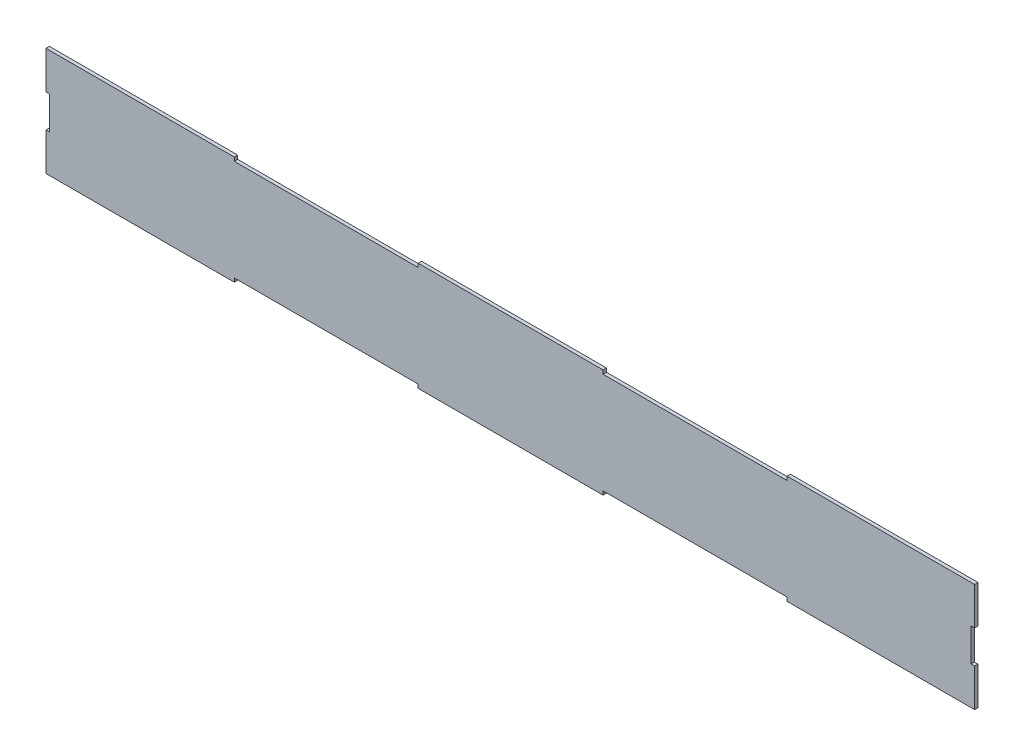
ISO-10303-21;
HEADER;
FILE_DESCRIPTION(('STEP AP214'),'2;1');
FILE_NAME('part.step','',(''),(''),'','','');
FILE_SCHEMA(('AUTOMOTIVE_DESIGN { 1 0 10303 214 1 1 1 1 }'));
ENDSEC;
DATA;
#1=APPLICATION_CONTEXT('core data for automotive mechanical design processes');
#2=APPLICATION_PROTOCOL_DEFINITION('international standard','automotive_design',2000,#1);
#3=PRODUCT_CONTEXT('',#1,'mechanical');
#4=PRODUCT('Part','Part','',(#3));
#5=PRODUCT_RELATED_PRODUCT_CATEGORY('part','',(#4));
#6=PRODUCT_DEFINITION_FORMATION('','',#4);
#7=PRODUCT_DEFINITION_CONTEXT('part definition',#1,'design');
#8=PRODUCT_DEFINITION('design','',#6,#7);
#9=PRODUCT_DEFINITION_SHAPE('','',#8);
#10=(LENGTH_UNIT() NAMED_UNIT(*) SI_UNIT(.MILLI.,.METRE.));
#11=(NAMED_UNIT(*) PLANE_ANGLE_UNIT() SI_UNIT($,.RADIAN.));
#12=(NAMED_UNIT(*) SI_UNIT($,.STERADIAN.) SOLID_ANGLE_UNIT());
#13=UNCERTAINTY_MEASURE_WITH_UNIT(LENGTH_MEASURE(1.E-05),#10,'distance_accuracy_value','');
#14=(GEOMETRIC_REPRESENTATION_CONTEXT(3) GLOBAL_UNCERTAINTY_ASSIGNED_CONTEXT((#13)) GLOBAL_UNIT_ASSIGNED_CONTEXT((#10,
#11,#12)) REPRESENTATION_CONTEXT('',''));
#15=CARTESIAN_POINT('',(0.,0.,0.));
#16=DIRECTION('',(0.,0.,1.));
#17=DIRECTION('',(1.,0.,0.));
#18=AXIS2_PLACEMENT_3D('',#15,#16,#17);
#19=CARTESIAN_POINT('',(-216.6666645,15.9933333333333,1.6));
#20=DIRECTION('',(1.,0.,0.));
#21=DIRECTION('',(0.,0.,-1.));
#22=AXIS2_PLACEMENT_3D('',#19,#20,#21);
#23=PLANE('',#22);
#24=DIRECTION('',(0.,-1.,0.));
#25=VECTOR('',#24,1.);
#26=CARTESIAN_POINT('',(-216.6666645,15.9933333333333,0.));
#27=LINE('',#26,#25);
#28=CARTESIAN_POINT('',(-216.6666645,31.5066666666668,0.));
#29=VERTEX_POINT('',#28);
#30=CARTESIAN_POINT('',(-216.6666645,15.9933333333333,0.));
#31=VERTEX_POINT('',#30);
#32=EDGE_CURVE('E171',#29,#31,#27,.T.);
#33=ORIENTED_EDGE('',*,*,#32,.T.);
#34=DIRECTION('',(0.,0.,-1.));
#35=VECTOR('',#34,1.);
#36=CARTESIAN_POINT('',(-216.6666645,15.9933333333333,1.6));
#37=LINE('',#36,#35);
#38=CARTESIAN_POINT('',(-216.6666645,15.9933333333333,1.6));
#39=VERTEX_POINT('',#38);
#40=EDGE_CURVE('E11',#39,#31,#37,.T.);
#41=ORIENTED_EDGE('',*,*,#40,.F.);
#42=DIRECTION('',(0.,-1.,0.));
#43=VECTOR('',#42,1.);
#44=CARTESIAN_POINT('',(-216.6666645,15.9933333333333,1.6));
#45=LINE('',#44,#43);
#46=CARTESIAN_POINT('',(-216.6666645,31.5066666666668,1.6));
#47=VERTEX_POINT('',#46);
#48=EDGE_CURVE('E204',#47,#39,#45,.T.);
#49=ORIENTED_EDGE('',*,*,#48,.F.);
#50=DIRECTION('',(0.,0.,-1.));
#51=VECTOR('',#50,1.);
#52=CARTESIAN_POINT('',(-216.6666645,31.5066666666668,1.6));
#53=LINE('',#52,#51);
#54=EDGE_CURVE('E316',#47,#29,#53,.T.);
#55=ORIENTED_EDGE('',*,*,#54,.T.);
#56=EDGE_LOOP('',(#33,#41,#49,#55));
#57=FACE_BOUND('',#56,.T.);
#58=ADVANCED_FACE('F33',(#57),#23,.F.);
#59=CARTESIAN_POINT('',(-216.6666645,15.9933333333333,1.6));
#60=DIRECTION('',(0.,-1.,0.));
#61=DIRECTION('',(0.,0.,-1.));
#62=AXIS2_PLACEMENT_3D('',#59,#60,#61);
#63=PLANE('',#62);
#64=DIRECTION('',(-1.,0.,0.));
#65=VECTOR('',#64,1.);
#66=CARTESIAN_POINT('',(-216.6666645,15.9933333333333,0.));
#67=LINE('',#66,#65);
#68=CARTESIAN_POINT('',(-218.4266645,15.9933333333333,0.));
#69=VERTEX_POINT('',#68);
#70=EDGE_CURVE('E174',#31,#69,#67,.T.);
#71=ORIENTED_EDGE('',*,*,#70,.T.);
#72=DIRECTION('',(0.,0.,-1.));
#73=VECTOR('',#72,1.);
#74=CARTESIAN_POINT('',(-218.4266645,15.9933333333333,1.6));
#75=LINE('',#74,#73);
#76=CARTESIAN_POINT('',(-218.4266645,15.9933333333333,1.6));
#77=VERTEX_POINT('',#76);
#78=EDGE_CURVE('E41',#77,#69,#75,.T.);
#79=ORIENTED_EDGE('',*,*,#78,.F.);
#80=DIRECTION('',(-1.,0.,0.));
#81=VECTOR('',#80,1.);
#82=CARTESIAN_POINT('',(-216.6666645,15.9933333333333,1.6));
#83=LINE('',#82,#81);
#84=EDGE_CURVE('E110',#39,#77,#83,.T.);
#85=ORIENTED_EDGE('',*,*,#84,.F.);
#86=ORIENTED_EDGE('',*,*,#40,.T.);
#87=EDGE_LOOP('',(#71,#79,#85,#86));
#88=FACE_BOUND('',#87,.T.);
#89=ADVANCED_FACE('F237',(#88),#63,.F.);
#90=CARTESIAN_POINT('',(-218.4266645,0.,1.6));
#91=DIRECTION('',(1.,0.,0.));
#92=DIRECTION('',(0.,0.,-1.));
#93=AXIS2_PLACEMENT_3D('',#90,#91,#92);
#94=PLANE('',#93);
#95=DIRECTION('',(0.,-1.,0.));
#96=VECTOR('',#95,1.);
#97=CARTESIAN_POINT('',(-218.4266645,0.,0.));
#98=LINE('',#97,#96);
#99=CARTESIAN_POINT('',(-218.4266645,-1.76000000000004,0.));
#100=VERTEX_POINT('',#99);
#101=EDGE_CURVE('E178',#69,#100,#98,.T.);
#102=ORIENTED_EDGE('',*,*,#101,.T.);
#103=DIRECTION('',(0.,0.,-1.));
#104=VECTOR('',#103,1.);
#105=CARTESIAN_POINT('',(-218.4266645,-1.76000000000004,1.6));
#106=LINE('',#105,#104);
#107=CARTESIAN_POINT('',(-218.4266645,-1.76000000000004,1.6));
#108=VERTEX_POINT('',#107);
#109=EDGE_CURVE('E229',#108,#100,#106,.T.);
#110=ORIENTED_EDGE('',*,*,#109,.F.);
#111=DIRECTION('',(0.,-1.,0.));
#112=VECTOR('',#111,1.);
#113=CARTESIAN_POINT('',(-218.4266645,0.,1.6));
#114=LINE('',#113,#112);
#115=EDGE_CURVE('E236',#77,#108,#114,.T.);
#116=ORIENTED_EDGE('',*,*,#115,.F.);
#117=ORIENTED_EDGE('',*,*,#78,.T.);
#118=EDGE_LOOP('',(#102,#110,#116,#117));
#119=FACE_BOUND('',#118,.T.);
#120=ADVANCED_FACE('F234',(#119),#94,.F.);
#121=CARTESIAN_POINT('',(-216.6666645,-1.76000000000004,1.6));
#122=DIRECTION('',(0.,1.,0.));
#123=DIRECTION('',(0.,0.,1.));
#124=AXIS2_PLACEMENT_3D('',#121,#122,#123);
#125=PLANE('',#124);
#126=DIRECTION('',(1.,0.,0.));
#127=VECTOR('',#126,1.);
#128=CARTESIAN_POINT('',(-216.6666645,-1.76000000000004,0.));
#129=LINE('',#128,#127);
#130=CARTESIAN_POINT('',(-129.8399987,-1.76000000000004,0.));
#131=VERTEX_POINT('',#130);
#132=EDGE_CURVE('E181',#100,#131,#129,.T.);
#133=ORIENTED_EDGE('',*,*,#132,.T.);
#134=DIRECTION('',(0.,0.,-1.));
#135=VECTOR('',#134,1.);
#136=CARTESIAN_POINT('',(-129.8399987,-1.76000000000004,1.6));
#137=LINE('',#136,#135);
#138=CARTESIAN_POINT('',(-129.8399987,-1.76000000000004,1.6));
#139=VERTEX_POINT('',#138);
#140=EDGE_CURVE('E226',#139,#131,#137,.T.);
#141=ORIENTED_EDGE('',*,*,#140,.F.);
#142=DIRECTION('',(1.,0.,0.));
#143=VECTOR('',#142,1.);
#144=CARTESIAN_POINT('',(-216.6666645,-1.76000000000004,1.6));
#145=LINE('',#144,#143);
#146=EDGE_CURVE('E257',#108,#139,#145,.T.);
#147=ORIENTED_EDGE('',*,*,#146,.F.);
#148=ORIENTED_EDGE('',*,*,#109,.T.);
#149=EDGE_LOOP('',(#133,#141,#147,#148));
#150=FACE_BOUND('',#149,.T.);
#151=ADVANCED_FACE('F248',(#150),#125,.F.);
#152=CARTESIAN_POINT('',(-129.8399987,0.,1.6));
#153=DIRECTION('',(-1.,0.,0.));
#154=DIRECTION('',(0.,0.,1.));
#155=AXIS2_PLACEMENT_3D('',#152,#153,#154);
#156=PLANE('',#155);
#157=DIRECTION('',(0.,1.,0.));
#158=VECTOR('',#157,1.);
#159=CARTESIAN_POINT('',(-129.8399987,0.,0.));
#160=LINE('',#159,#158);
#161=CARTESIAN_POINT('',(-129.8399987,0.,0.));
#162=VERTEX_POINT('',#161);
#163=EDGE_CURVE('E183',#131,#162,#160,.T.);
#164=ORIENTED_EDGE('',*,*,#163,.T.);
#165=DIRECTION('',(0.,0.,-1.));
#166=VECTOR('',#165,1.);
#167=CARTESIAN_POINT('',(-129.8399987,0.,1.6));
#168=LINE('',#167,#166);
#169=CARTESIAN_POINT('',(-129.8399987,0.,1.6));
#170=VERTEX_POINT('',#169);
#171=EDGE_CURVE('E223',#170,#162,#168,.T.);
#172=ORIENTED_EDGE('',*,*,#171,.F.);
#173=DIRECTION('',(0.,1.,0.));
#174=VECTOR('',#173,1.);
#175=CARTESIAN_POINT('',(-129.8399987,0.,1.6));
#176=LINE('',#175,#174);
#177=EDGE_CURVE('E254',#139,#170,#176,.T.);
#178=ORIENTED_EDGE('',*,*,#177,.F.);
#179=ORIENTED_EDGE('',*,*,#140,.T.);
#180=EDGE_LOOP('',(#164,#172,#178,#179));
#181=FACE_BOUND('',#180,.T.);
#182=ADVANCED_FACE('F252',(#181),#156,.F.);
#183=CARTESIAN_POINT('',(-43.3333329,0.,1.6));
#184=DIRECTION('',(0.,1.,0.));
#185=DIRECTION('',(-1.,0.,0.));
#186=AXIS2_PLACEMENT_3D('',#183,#184,#185);
#187=PLANE('',#186);
#188=DIRECTION('',(1.,0.,0.));
#189=VECTOR('',#188,1.);
#190=CARTESIAN_POINT('',(-43.3333329,0.,0.));
#191=LINE('',#190,#189);
#192=CARTESIAN_POINT('',(-43.3333329,0.,0.));
#193=VERTEX_POINT('',#192);
#194=EDGE_CURVE('E185',#162,#193,#191,.T.);
#195=ORIENTED_EDGE('',*,*,#194,.T.);
#196=DIRECTION('',(0.,0.,-1.));
#197=VECTOR('',#196,1.);
#198=CARTESIAN_POINT('',(-43.3333329,0.,1.6));
#199=LINE('',#198,#197);
#200=CARTESIAN_POINT('',(-43.3333329,0.,1.6));
#201=VERTEX_POINT('',#200);
#202=EDGE_CURVE('E220',#201,#193,#199,.T.);
#203=ORIENTED_EDGE('',*,*,#202,.F.);
#204=DIRECTION('',(1.,0.,0.));
#205=VECTOR('',#204,1.);
#206=CARTESIAN_POINT('',(-43.3333329,0.,1.6));
#207=LINE('',#206,#205);
#208=EDGE_CURVE('E256',#170,#201,#207,.T.);
#209=ORIENTED_EDGE('',*,*,#208,.F.);
#210=ORIENTED_EDGE('',*,*,#171,.T.);
#211=EDGE_LOOP('',(#195,#203,#209,#210));
#212=FACE_BOUND('',#211,.T.);
#213=ADVANCED_FACE('F545',(#212),#187,.F.);
#214=CARTESIAN_POINT('',(-43.3333329,0.,1.6));
#215=DIRECTION('',(1.,0.,0.));
#216=DIRECTION('',(0.,0.,-1.));
#217=AXIS2_PLACEMENT_3D('',#214,#215,#216);
#218=PLANE('',#217);
#219=DIRECTION('',(0.,-1.,0.));
#220=VECTOR('',#219,1.);
#221=CARTESIAN_POINT('',(-43.3333329,0.,0.));
#222=LINE('',#221,#220);
#223=CARTESIAN_POINT('',(-43.3333329,-1.76000000000002,0.));
#224=VERTEX_POINT('',#223);
#225=EDGE_CURVE('E187',#193,#224,#222,.T.);
#226=ORIENTED_EDGE('',*,*,#225,.T.);
#227=DIRECTION('',(0.,0.,-1.));
#228=VECTOR('',#227,1.);
#229=CARTESIAN_POINT('',(-43.3333329,-1.76000000000002,1.6));
#230=LINE('',#229,#228);
#231=CARTESIAN_POINT('',(-43.3333329,-1.76000000000002,1.6));
#232=VERTEX_POINT('',#231);
#233=EDGE_CURVE('E217',#232,#224,#230,.T.);
#234=ORIENTED_EDGE('',*,*,#233,.F.);
#235=DIRECTION('',(0.,-1.,0.));
#236=VECTOR('',#235,1.);
#237=CARTESIAN_POINT('',(-43.3333329,0.,1.6));
#238=LINE('',#237,#236);
#239=EDGE_CURVE('E259',#201,#232,#238,.T.);
#240=ORIENTED_EDGE('',*,*,#239,.F.);
#241=ORIENTED_EDGE('',*,*,#202,.T.);
#242=EDGE_LOOP('',(#226,#234,#240,#241));
#243=FACE_BOUND('',#242,.T.);
#244=ADVANCED_FACE('F548',(#243),#218,.F.);
#245=CARTESIAN_POINT('',(-43.3333329,-1.76000000000002,1.6));
#246=DIRECTION('',(0.,1.,0.));
#247=DIRECTION('',(0.,0.,1.));
#248=AXIS2_PLACEMENT_3D('',#245,#246,#247);
#249=PLANE('',#248);
#250=DIRECTION('',(1.,0.,0.));
#251=VECTOR('',#250,1.);
#252=CARTESIAN_POINT('',(-43.3333329,-1.76000000000002,0.));
#253=LINE('',#252,#251);
#254=CARTESIAN_POINT('',(43.6533329,-1.76000000000002,0.));
#255=VERTEX_POINT('',#254);
#256=EDGE_CURVE('E189',#224,#255,#253,.T.);
#257=ORIENTED_EDGE('',*,*,#256,.T.);
#258=DIRECTION('',(0.,0.,-1.));
#259=VECTOR('',#258,1.);
#260=CARTESIAN_POINT('',(43.6533329,-1.76000000000002,1.6));
#261=LINE('',#260,#259);
#262=CARTESIAN_POINT('',(43.6533329,-1.76000000000002,1.6));
#263=VERTEX_POINT('',#262);
#264=EDGE_CURVE('E214',#263,#255,#261,.T.);
#265=ORIENTED_EDGE('',*,*,#264,.F.);
#266=DIRECTION('',(1.,0.,0.));
#267=VECTOR('',#266,1.);
#268=CARTESIAN_POINT('',(-43.3333329,-1.76000000000002,1.6));
#269=LINE('',#268,#267);
#270=EDGE_CURVE('E265',#232,#263,#269,.T.);
#271=ORIENTED_EDGE('',*,*,#270,.F.);
#272=ORIENTED_EDGE('',*,*,#233,.T.);
#273=EDGE_LOOP('',(#257,#265,#271,#272));
#274=FACE_BOUND('',#273,.T.);
#275=ADVANCED_FACE('F552',(#274),#249,.F.);
#276=CARTESIAN_POINT('',(43.6533329,0.,1.6));
#277=DIRECTION('',(-1.,0.,0.));
#278=DIRECTION('',(0.,0.,1.));
#279=AXIS2_PLACEMENT_3D('',#276,#277,#278);
#280=PLANE('',#279);
#281=DIRECTION('',(0.,1.,0.));
#282=VECTOR('',#281,1.);
#283=CARTESIAN_POINT('',(43.6533329,0.,0.));
#284=LINE('',#283,#282);
#285=CARTESIAN_POINT('',(43.6533329,0.,0.));
#286=VERTEX_POINT('',#285);
#287=EDGE_CURVE('E191',#255,#286,#284,.T.);
#288=ORIENTED_EDGE('',*,*,#287,.T.);
#289=DIRECTION('',(0.,0.,-1.));
#290=VECTOR('',#289,1.);
#291=CARTESIAN_POINT('',(43.6533329,0.,1.6));
#292=LINE('',#291,#290);
#293=CARTESIAN_POINT('',(43.6533329,0.,1.6));
#294=VERTEX_POINT('',#293);
#295=EDGE_CURVE('E211',#294,#286,#292,.T.);
#296=ORIENTED_EDGE('',*,*,#295,.F.);
#297=DIRECTION('',(0.,1.,0.));
#298=VECTOR('',#297,1.);
#299=CARTESIAN_POINT('',(43.6533329,0.,1.6));
#300=LINE('',#299,#298);
#301=EDGE_CURVE('E267',#263,#294,#300,.T.);
#302=ORIENTED_EDGE('',*,*,#301,.F.);
#303=ORIENTED_EDGE('',*,*,#264,.T.);
#304=EDGE_LOOP('',(#288,#296,#302,#303));
#305=FACE_BOUND('',#304,.T.);
#306=ADVANCED_FACE('F556',(#305),#280,.F.);
#307=CARTESIAN_POINT('',(130.1599987,0.,1.6));
#308=DIRECTION('',(0.,1.,0.));
#309=DIRECTION('',(-1.,0.,0.));
#310=AXIS2_PLACEMENT_3D('',#307,#308,#309);
#311=PLANE('',#310);
#312=DIRECTION('',(1.,0.,0.));
#313=VECTOR('',#312,1.);
#314=CARTESIAN_POINT('',(130.1599987,0.,0.));
#315=LINE('',#314,#313);
#316=CARTESIAN_POINT('',(130.1599987,0.,0.));
#317=VERTEX_POINT('',#316);
#318=EDGE_CURVE('E193',#286,#317,#315,.T.);
#319=ORIENTED_EDGE('',*,*,#318,.T.);
#320=DIRECTION('',(0.,0.,-1.));
#321=VECTOR('',#320,1.);
#322=CARTESIAN_POINT('',(130.1599987,0.,1.6));
#323=LINE('',#322,#321);
#324=CARTESIAN_POINT('',(130.1599987,0.,1.6));
#325=VERTEX_POINT('',#324);
#326=EDGE_CURVE('E208',#325,#317,#323,.T.);
#327=ORIENTED_EDGE('',*,*,#326,.F.);
#328=DIRECTION('',(1.,0.,0.));
#329=VECTOR('',#328,1.);
#330=CARTESIAN_POINT('',(130.1599987,0.,1.6));
#331=LINE('',#330,#329);
#332=EDGE_CURVE('E269',#294,#325,#331,.T.);
#333=ORIENTED_EDGE('',*,*,#332,.F.);
#334=ORIENTED_EDGE('',*,*,#295,.T.);
#335=EDGE_LOOP('',(#319,#327,#333,#334));
#336=FACE_BOUND('',#335,.T.);
#337=ADVANCED_FACE('F275',(#336),#311,.F.);
#338=CARTESIAN_POINT('',(130.1599987,0.,1.6));
#339=DIRECTION('',(1.,0.,0.));
#340=DIRECTION('',(0.,0.,-1.));
#341=AXIS2_PLACEMENT_3D('',#338,#339,#340);
#342=PLANE('',#341);
#343=DIRECTION('',(0.,-1.,0.));
#344=VECTOR('',#343,1.);
#345=CARTESIAN_POINT('',(130.1599987,0.,0.));
#346=LINE('',#345,#344);
#347=CARTESIAN_POINT('',(130.1599987,-1.76000000000004,0.));
#348=VERTEX_POINT('',#347);
#349=EDGE_CURVE('E195',#317,#348,#346,.T.);
#350=ORIENTED_EDGE('',*,*,#349,.T.);
#351=DIRECTION('',(0.,0.,-1.));
#352=VECTOR('',#351,1.);
#353=CARTESIAN_POINT('',(130.1599987,-1.76000000000004,1.6));
#354=LINE('',#353,#352);
#355=CARTESIAN_POINT('',(130.1599987,-1.76000000000004,1.6));
#356=VERTEX_POINT('',#355);
#357=EDGE_CURVE('E160',#356,#348,#354,.T.);
#358=ORIENTED_EDGE('',*,*,#357,.F.);
#359=DIRECTION('',(0.,-1.,0.));
#360=VECTOR('',#359,1.);
#361=CARTESIAN_POINT('',(130.1599987,0.,1.6));
#362=LINE('',#361,#360);
#363=EDGE_CURVE('E151',#325,#356,#362,.T.);
#364=ORIENTED_EDGE('',*,*,#363,.F.);
#365=ORIENTED_EDGE('',*,*,#326,.T.);
#366=EDGE_LOOP('',(#350,#358,#364,#365));
#367=FACE_BOUND('',#366,.T.);
#368=ADVANCED_FACE('F279',(#367),#342,.F.);
#369=CARTESIAN_POINT('',(216.6666645,-1.76000000000004,1.6));
#370=DIRECTION('',(0.,1.,0.));
#371=DIRECTION('',(0.,0.,1.));
#372=AXIS2_PLACEMENT_3D('',#369,#370,#371);
#373=PLANE('',#372);
#374=DIRECTION('',(1.,0.,0.));
#375=VECTOR('',#374,1.);
#376=CARTESIAN_POINT('',(216.6666645,-1.76000000000004,0.));
#377=LINE('',#376,#375);
#378=CARTESIAN_POINT('',(218.4266645,-1.76000000000004,0.));
#379=VERTEX_POINT('',#378);
#380=EDGE_CURVE('E159',#348,#379,#377,.T.);
#381=ORIENTED_EDGE('',*,*,#380,.T.);
#382=DIRECTION('',(0.,0.,-1.));
#383=VECTOR('',#382,1.);
#384=CARTESIAN_POINT('',(218.4266645,-1.76000000000004,1.6));
#385=LINE('',#384,#383);
#386=CARTESIAN_POINT('',(218.4266645,-1.76000000000004,1.6));
#387=VERTEX_POINT('',#386);
#388=EDGE_CURVE('E157',#387,#379,#385,.T.);
#389=ORIENTED_EDGE('',*,*,#388,.F.);
#390=DIRECTION('',(1.,0.,0.));
#391=VECTOR('',#390,1.);
#392=CARTESIAN_POINT('',(130.1599987,-1.76000000000004,1.6));
#393=LINE('',#392,#391);
#394=EDGE_CURVE('E145',#356,#387,#393,.T.);
#395=ORIENTED_EDGE('',*,*,#394,.F.);
#396=ORIENTED_EDGE('',*,*,#357,.T.);
#397=EDGE_LOOP('',(#381,#389,#395,#396));
#398=FACE_BOUND('',#397,.T.);
#399=ADVANCED_FACE('F158',(#398),#373,.F.);
#400=CARTESIAN_POINT('',(218.4266645,0.,1.6));
#401=DIRECTION('',(-1.,0.,0.));
#402=DIRECTION('',(0.,0.,1.));
#403=AXIS2_PLACEMENT_3D('',#400,#401,#402);
#404=PLANE('',#403);
#405=DIRECTION('',(0.,1.,0.));
#406=VECTOR('',#405,1.);
#407=CARTESIAN_POINT('',(218.4266645,0.,0.));
#408=LINE('',#407,#406);
#409=CARTESIAN_POINT('',(218.4266645,15.9933333333333,0.));
#410=VERTEX_POINT('',#409);
#411=EDGE_CURVE('E96',#379,#410,#408,.T.);
#412=ORIENTED_EDGE('',*,*,#411,.T.);
#413=DIRECTION('',(0.,0.,-1.));
#414=VECTOR('',#413,1.);
#415=CARTESIAN_POINT('',(218.4266645,15.9933333333333,1.6));
#416=LINE('',#415,#414);
#417=CARTESIAN_POINT('',(218.4266645,15.9933333333333,1.6));
#418=VERTEX_POINT('',#417);
#419=EDGE_CURVE('E161',#418,#410,#416,.T.);
#420=ORIENTED_EDGE('',*,*,#419,.F.);
#421=DIRECTION('',(0.,1.,0.));
#422=VECTOR('',#421,1.);
#423=CARTESIAN_POINT('',(218.4266645,-1.76000000000004,1.6));
#424=LINE('',#423,#422);
#425=EDGE_CURVE('E149',#387,#418,#424,.T.);
#426=ORIENTED_EDGE('',*,*,#425,.F.);
#427=ORIENTED_EDGE('',*,*,#388,.T.);
#428=EDGE_LOOP('',(#412,#420,#426,#427));
#429=FACE_BOUND('',#428,.T.);
#430=ADVANCED_FACE('F163',(#429),#404,.F.);
#431=CARTESIAN_POINT('',(218.4266645,15.9933333333333,1.6));
#432=DIRECTION('',(0.,-1.,0.));
#433=DIRECTION('',(0.,0.,-1.));
#434=AXIS2_PLACEMENT_3D('',#431,#432,#433);
#435=PLANE('',#434);
#436=DIRECTION('',(-1.,0.,0.));
#437=VECTOR('',#436,1.);
#438=CARTESIAN_POINT('',(218.4266645,15.9933333333333,0.));
#439=LINE('',#438,#437);
#440=CARTESIAN_POINT('',(216.6666645,15.9933333333333,0.));
#441=VERTEX_POINT('',#440);
#442=EDGE_CURVE('E102',#410,#441,#439,.T.);
#443=ORIENTED_EDGE('',*,*,#442,.T.);
#444=DIRECTION('',(0.,0.,-1.));
#445=VECTOR('',#444,1.);
#446=CARTESIAN_POINT('',(216.6666645,15.9933333333333,1.6));
#447=LINE('',#446,#445);
#448=CARTESIAN_POINT('',(216.6666645,15.9933333333333,1.6));
#449=VERTEX_POINT('',#448);
#450=EDGE_CURVE('E170',#449,#441,#447,.T.);
#451=ORIENTED_EDGE('',*,*,#450,.F.);
#452=DIRECTION('',(-1.,0.,0.));
#453=VECTOR('',#452,1.);
#454=CARTESIAN_POINT('',(218.4266645,15.9933333333333,1.6));
#455=LINE('',#454,#453);
#456=EDGE_CURVE('E49',#418,#449,#455,.T.);
#457=ORIENTED_EDGE('',*,*,#456,.F.);
#458=ORIENTED_EDGE('',*,*,#419,.T.);
#459=EDGE_LOOP('',(#443,#451,#457,#458));
#460=FACE_BOUND('',#459,.T.);
#461=ADVANCED_FACE('F569',(#460),#435,.F.);
#462=CARTESIAN_POINT('',(216.6666645,15.9933333333333,1.6));
#463=DIRECTION('',(-1.,0.,0.));
#464=DIRECTION('',(0.,0.,1.));
#465=AXIS2_PLACEMENT_3D('',#462,#463,#464);
#466=PLANE('',#465);
#467=DIRECTION('',(0.,1.,0.));
#468=VECTOR('',#467,1.);
#469=CARTESIAN_POINT('',(216.6666645,15.9933333333333,0.));
#470=LINE('',#469,#468);
#471=CARTESIAN_POINT('',(216.6666645,31.5066666666668,0.));
#472=VERTEX_POINT('',#471);
#473=EDGE_CURVE('E201',#441,#472,#470,.T.);
#474=ORIENTED_EDGE('',*,*,#473,.T.);
#475=DIRECTION('',(0.,0.,-1.));
#476=VECTOR('',#475,1.);
#477=CARTESIAN_POINT('',(216.6666645,31.5066666666668,1.6));
#478=LINE('',#477,#476);
#479=CARTESIAN_POINT('',(216.6666645,31.5066666666668,1.6));
#480=VERTEX_POINT('',#479);
#481=EDGE_CURVE('E175',#480,#472,#478,.T.);
#482=ORIENTED_EDGE('',*,*,#481,.F.);
#483=DIRECTION('',(0.,1.,0.));
#484=VECTOR('',#483,1.);
#485=CARTESIAN_POINT('',(216.6666645,15.9933333333333,1.6));
#486=LINE('',#485,#484);
#487=EDGE_CURVE('E165',#449,#480,#486,.T.);
#488=ORIENTED_EDGE('',*,*,#487,.F.);
#489=ORIENTED_EDGE('',*,*,#450,.T.);
#490=EDGE_LOOP('',(#474,#482,#488,#489));
#491=FACE_BOUND('',#490,.T.);
#492=ADVANCED_FACE('F290',(#491),#466,.F.);
#493=CARTESIAN_POINT('',(0.,0.,1.6));
#494=DIRECTION('',(0.,0.,1.));
#495=DIRECTION('',(1.,0.,0.));
#496=AXIS2_PLACEMENT_3D('',#493,#494,#495);
#497=PLANE('',#496);
#498=ORIENTED_EDGE('',*,*,#48,.T.);
#499=ORIENTED_EDGE('',*,*,#84,.T.);
#500=ORIENTED_EDGE('',*,*,#115,.T.);
#501=ORIENTED_EDGE('',*,*,#146,.T.);
#502=ORIENTED_EDGE('',*,*,#177,.T.);
#503=ORIENTED_EDGE('',*,*,#208,.T.);
#504=ORIENTED_EDGE('',*,*,#239,.T.);
#505=ORIENTED_EDGE('',*,*,#270,.T.);
#506=ORIENTED_EDGE('',*,*,#301,.T.);
#507=ORIENTED_EDGE('',*,*,#332,.T.);
#508=ORIENTED_EDGE('',*,*,#363,.T.);
#509=ORIENTED_EDGE('',*,*,#394,.T.);
#510=ORIENTED_EDGE('',*,*,#425,.T.);
#511=ORIENTED_EDGE('',*,*,#456,.T.);
#512=ORIENTED_EDGE('',*,*,#487,.T.);
#513=DIRECTION('',(-1.,0.,0.));
#514=VECTOR('',#513,1.);
#515=CARTESIAN_POINT('',(218.4266645,31.5066666666668,1.6));
#516=LINE('',#515,#514);
#517=CARTESIAN_POINT('',(218.4266645,31.5066666666668,1.6));
#518=VERTEX_POINT('',#517);
#519=EDGE_CURVE('E300',#518,#480,#516,.T.);
#520=ORIENTED_EDGE('',*,*,#519,.F.);
#521=DIRECTION('',(0.,-1.,0.));
#522=VECTOR('',#521,1.);
#523=CARTESIAN_POINT('',(218.4266645,47.5000000000001,1.6));
#524=LINE('',#523,#522);
#525=CARTESIAN_POINT('',(218.4266645,49.2600000000001,1.6));
#526=VERTEX_POINT('',#525);
#527=EDGE_CURVE('E330',#526,#518,#524,.T.);
#528=ORIENTED_EDGE('',*,*,#527,.F.);
#529=DIRECTION('',(1.,0.,0.));
#530=VECTOR('',#529,1.);
#531=CARTESIAN_POINT('',(216.6666645,49.2600000000001,1.6));
#532=LINE('',#531,#530);
#533=CARTESIAN_POINT('',(130.1599987,49.2600000000001,1.6));
#534=VERTEX_POINT('',#533);
#535=EDGE_CURVE('E378',#534,#526,#532,.T.);
#536=ORIENTED_EDGE('',*,*,#535,.F.);
#537=DIRECTION('',(0.,1.,0.));
#538=VECTOR('',#537,1.);
#539=CARTESIAN_POINT('',(130.1599987,47.5,1.6));
#540=LINE('',#539,#538);
#541=CARTESIAN_POINT('',(130.1599987,47.5,1.6));
#542=VERTEX_POINT('',#541);
#543=EDGE_CURVE('E480',#542,#534,#540,.T.);
#544=ORIENTED_EDGE('',*,*,#543,.F.);
#545=DIRECTION('',(1.,0.,0.));
#546=VECTOR('',#545,1.);
#547=CARTESIAN_POINT('',(130.1599987,47.5,1.6));
#548=LINE('',#547,#546);
#549=CARTESIAN_POINT('',(43.6533329,47.5,1.6));
#550=VERTEX_POINT('',#549);
#551=EDGE_CURVE('E485',#550,#542,#548,.T.);
#552=ORIENTED_EDGE('',*,*,#551,.F.);
#553=DIRECTION('',(0.,-1.,0.));
#554=VECTOR('',#553,1.);
#555=CARTESIAN_POINT('',(43.6533329,47.5,1.6));
#556=LINE('',#555,#554);
#557=CARTESIAN_POINT('',(43.6533329,49.2600000000001,1.6));
#558=VERTEX_POINT('',#557);
#559=EDGE_CURVE('E488',#558,#550,#556,.T.);
#560=ORIENTED_EDGE('',*,*,#559,.F.);
#561=DIRECTION('',(1.,0.,0.));
#562=VECTOR('',#561,1.);
#563=CARTESIAN_POINT('',(-43.3333329,49.2600000000001,1.6));
#564=LINE('',#563,#562);
#565=CARTESIAN_POINT('',(-43.3333329,49.2600000000001,1.6));
#566=VERTEX_POINT('',#565);
#567=EDGE_CURVE('E491',#566,#558,#564,.T.);
#568=ORIENTED_EDGE('',*,*,#567,.F.);
#569=DIRECTION('',(0.,1.,0.));
#570=VECTOR('',#569,1.);
#571=CARTESIAN_POINT('',(-43.3333329,47.5000000000001,1.6));
#572=LINE('',#571,#570);
#573=CARTESIAN_POINT('',(-43.3333329,47.5000000000001,1.6));
#574=VERTEX_POINT('',#573);
#575=EDGE_CURVE('E494',#574,#566,#572,.T.);
#576=ORIENTED_EDGE('',*,*,#575,.F.);
#577=DIRECTION('',(1.,0.,0.));
#578=VECTOR('',#577,1.);
#579=CARTESIAN_POINT('',(-43.3333329,47.5000000000001,1.6));
#580=LINE('',#579,#578);
#581=CARTESIAN_POINT('',(-129.8399987,47.5000000000001,1.6));
#582=VERTEX_POINT('',#581);
#583=EDGE_CURVE('E497',#582,#574,#580,.T.);
#584=ORIENTED_EDGE('',*,*,#583,.F.);
#585=DIRECTION('',(0.,-1.,0.));
#586=VECTOR('',#585,1.);
#587=CARTESIAN_POINT('',(-129.8399987,47.5000000000001,1.6));
#588=LINE('',#587,#586);
#589=CARTESIAN_POINT('',(-129.8399987,49.2600000000001,1.6));
#590=VERTEX_POINT('',#589);
#591=EDGE_CURVE('E430',#590,#582,#588,.T.);
#592=ORIENTED_EDGE('',*,*,#591,.F.);
#593=DIRECTION('',(1.,0.,0.));
#594=VECTOR('',#593,1.);
#595=CARTESIAN_POINT('',(-216.6666645,49.2600000000001,1.6));
#596=LINE('',#595,#594);
#597=CARTESIAN_POINT('',(-218.4266645,49.2600000000001,1.6));
#598=VERTEX_POINT('',#597);
#599=EDGE_CURVE('E422',#598,#590,#596,.T.);
#600=ORIENTED_EDGE('',*,*,#599,.F.);
#601=DIRECTION('',(0.,1.,0.));
#602=VECTOR('',#601,1.);
#603=CARTESIAN_POINT('',(-218.4266645,47.5000000000001,1.6));
#604=LINE('',#603,#602);
#605=CARTESIAN_POINT('',(-218.4266645,31.5066666666668,1.6));
#606=VERTEX_POINT('',#605);
#607=EDGE_CURVE('E501',#606,#598,#604,.T.);
#608=ORIENTED_EDGE('',*,*,#607,.F.);
#609=DIRECTION('',(-1.,0.,0.));
#610=VECTOR('',#609,1.);
#611=CARTESIAN_POINT('',(-216.6666645,31.5066666666668,1.6));
#612=LINE('',#611,#610);
#613=EDGE_CURVE('E313',#47,#606,#612,.T.);
#614=ORIENTED_EDGE('',*,*,#613,.F.);
#615=EDGE_LOOP('',(#498,#499,#500,#501,#502,#503,#504,#505,#506,#507,#508,#509,#510,#511,#512,
#520,#528,#536,#544,#552,#560,#568,#576,#584,#592,#600,#608,#614));
#616=FACE_BOUND('',#615,.T.);
#617=ADVANCED_FACE('F147',(#616),#497,.T.);
#618=CARTESIAN_POINT('',(0.,0.,0.));
#619=DIRECTION('',(0.,0.,1.));
#620=DIRECTION('',(1.,0.,0.));
#621=AXIS2_PLACEMENT_3D('',#618,#619,#620);
#622=PLANE('',#621);
#623=ORIENTED_EDGE('',*,*,#32,.F.);
#624=DIRECTION('',(-1.,0.,0.));
#625=VECTOR('',#624,1.);
#626=CARTESIAN_POINT('',(-216.6666645,31.5066666666668,0.));
#627=LINE('',#626,#625);
#628=CARTESIAN_POINT('',(-218.4266645,31.5066666666668,0.));
#629=VERTEX_POINT('',#628);
#630=EDGE_CURVE('E323',#29,#629,#627,.T.);
#631=ORIENTED_EDGE('',*,*,#630,.T.);
#632=DIRECTION('',(0.,1.,0.));
#633=VECTOR('',#632,1.);
#634=CARTESIAN_POINT('',(-218.4266645,47.5000000000001,0.));
#635=LINE('',#634,#633);
#636=CARTESIAN_POINT('',(-218.4266645,49.2600000000001,0.));
#637=VERTEX_POINT('',#636);
#638=EDGE_CURVE('E328',#629,#637,#635,.T.);
#639=ORIENTED_EDGE('',*,*,#638,.T.);
#640=DIRECTION('',(1.,0.,0.));
#641=VECTOR('',#640,1.);
#642=CARTESIAN_POINT('',(-216.6666645,49.2600000000001,0.));
#643=LINE('',#642,#641);
#644=CARTESIAN_POINT('',(-129.8399987,49.2600000000001,0.));
#645=VERTEX_POINT('',#644);
#646=EDGE_CURVE('E332',#637,#645,#643,.T.);
#647=ORIENTED_EDGE('',*,*,#646,.T.);
#648=DIRECTION('',(0.,-1.,0.));
#649=VECTOR('',#648,1.);
#650=CARTESIAN_POINT('',(-129.8399987,47.5000000000001,0.));
#651=LINE('',#650,#649);
#652=CARTESIAN_POINT('',(-129.8399987,47.5000000000001,0.));
#653=VERTEX_POINT('',#652);
#654=EDGE_CURVE('E406',#645,#653,#651,.T.);
#655=ORIENTED_EDGE('',*,*,#654,.T.);
#656=DIRECTION('',(1.,0.,0.));
#657=VECTOR('',#656,1.);
#658=CARTESIAN_POINT('',(-43.3333329,47.5000000000001,0.));
#659=LINE('',#658,#657);
#660=CARTESIAN_POINT('',(-43.3333329,47.5000000000001,0.));
#661=VERTEX_POINT('',#660);
#662=EDGE_CURVE('E403',#653,#661,#659,.T.);
#663=ORIENTED_EDGE('',*,*,#662,.T.);
#664=DIRECTION('',(0.,1.,0.));
#665=VECTOR('',#664,1.);
#666=CARTESIAN_POINT('',(-43.3333329,47.5000000000001,0.));
#667=LINE('',#666,#665);
#668=CARTESIAN_POINT('',(-43.3333329,49.2600000000001,0.));
#669=VERTEX_POINT('',#668);
#670=EDGE_CURVE('E400',#661,#669,#667,.T.);
#671=ORIENTED_EDGE('',*,*,#670,.T.);
#672=DIRECTION('',(1.,0.,0.));
#673=VECTOR('',#672,1.);
#674=CARTESIAN_POINT('',(-43.3333329,49.2600000000001,0.));
#675=LINE('',#674,#673);
#676=CARTESIAN_POINT('',(43.6533329,49.2600000000001,0.));
#677=VERTEX_POINT('',#676);
#678=EDGE_CURVE('E397',#669,#677,#675,.T.);
#679=ORIENTED_EDGE('',*,*,#678,.T.);
#680=DIRECTION('',(0.,-1.,0.));
#681=VECTOR('',#680,1.);
#682=CARTESIAN_POINT('',(43.6533329,47.5,0.));
#683=LINE('',#682,#681);
#684=CARTESIAN_POINT('',(43.6533329,47.5,0.));
#685=VERTEX_POINT('',#684);
#686=EDGE_CURVE('E394',#677,#685,#683,.T.);
#687=ORIENTED_EDGE('',*,*,#686,.T.);
#688=DIRECTION('',(1.,0.,0.));
#689=VECTOR('',#688,1.);
#690=CARTESIAN_POINT('',(130.1599987,47.5,0.));
#691=LINE('',#690,#689);
#692=CARTESIAN_POINT('',(130.1599987,47.5,0.));
#693=VERTEX_POINT('',#692);
#694=EDGE_CURVE('E391',#685,#693,#691,.T.);
#695=ORIENTED_EDGE('',*,*,#694,.T.);
#696=DIRECTION('',(0.,1.,0.));
#697=VECTOR('',#696,1.);
#698=CARTESIAN_POINT('',(130.1599987,47.5,0.));
#699=LINE('',#698,#697);
#700=CARTESIAN_POINT('',(130.1599987,49.2600000000001,0.));
#701=VERTEX_POINT('',#700);
#702=EDGE_CURVE('E385',#693,#701,#699,.T.);
#703=ORIENTED_EDGE('',*,*,#702,.T.);
#704=DIRECTION('',(1.,0.,0.));
#705=VECTOR('',#704,1.);
#706=CARTESIAN_POINT('',(130.1599987,49.2600000000001,0.));
#707=LINE('',#706,#705);
#708=CARTESIAN_POINT('',(218.4266645,49.2600000000001,0.));
#709=VERTEX_POINT('',#708);
#710=EDGE_CURVE('E374',#701,#709,#707,.T.);
#711=ORIENTED_EDGE('',*,*,#710,.T.);
#712=DIRECTION('',(0.,-1.,0.));
#713=VECTOR('',#712,1.);
#714=CARTESIAN_POINT('',(218.4266645,49.2600000000001,0.));
#715=LINE('',#714,#713);
#716=CARTESIAN_POINT('',(218.4266645,31.5066666666668,0.));
#717=VERTEX_POINT('',#716);
#718=EDGE_CURVE('E382',#709,#717,#715,.T.);
#719=ORIENTED_EDGE('',*,*,#718,.T.);
#720=DIRECTION('',(-1.,0.,0.));
#721=VECTOR('',#720,1.);
#722=CARTESIAN_POINT('',(218.4266645,31.5066666666668,0.));
#723=LINE('',#722,#721);
#724=EDGE_CURVE('E286',#717,#472,#723,.T.);
#725=ORIENTED_EDGE('',*,*,#724,.T.);
#726=ORIENTED_EDGE('',*,*,#473,.F.);
#727=ORIENTED_EDGE('',*,*,#442,.F.);
#728=ORIENTED_EDGE('',*,*,#411,.F.);
#729=ORIENTED_EDGE('',*,*,#380,.F.);
#730=ORIENTED_EDGE('',*,*,#349,.F.);
#731=ORIENTED_EDGE('',*,*,#318,.F.);
#732=ORIENTED_EDGE('',*,*,#287,.F.);
#733=ORIENTED_EDGE('',*,*,#256,.F.);
#734=ORIENTED_EDGE('',*,*,#225,.F.);
#735=ORIENTED_EDGE('',*,*,#194,.F.);
#736=ORIENTED_EDGE('',*,*,#163,.F.);
#737=ORIENTED_EDGE('',*,*,#132,.F.);
#738=ORIENTED_EDGE('',*,*,#101,.F.);
#739=ORIENTED_EDGE('',*,*,#70,.F.);
#740=EDGE_LOOP('',(#623,#631,#639,#647,#655,#663,#671,#679,#687,#695,#703,#711,#719,#725,#726,
#727,#728,#729,#730,#731,#732,#733,#734,#735,#736,#737,#738,#739));
#741=FACE_BOUND('',#740,.T.);
#742=ADVANCED_FACE('F241',(#741),#622,.F.);
#743=CARTESIAN_POINT('',(218.4266645,31.5066666666668,1.6));
#744=DIRECTION('',(0.,-1.,0.));
#745=DIRECTION('',(1.,0.,0.));
#746=AXIS2_PLACEMENT_3D('',#743,#744,#745);
#747=PLANE('',#746);
#748=ORIENTED_EDGE('',*,*,#724,.F.);
#749=DIRECTION('',(0.,0.,-1.));
#750=VECTOR('',#749,1.);
#751=CARTESIAN_POINT('',(218.4266645,31.5066666666668,1.6));
#752=LINE('',#751,#750);
#753=EDGE_CURVE('E301',#518,#717,#752,.T.);
#754=ORIENTED_EDGE('',*,*,#753,.F.);
#755=ORIENTED_EDGE('',*,*,#519,.T.);
#756=ORIENTED_EDGE('',*,*,#481,.T.);
#757=EDGE_LOOP('',(#748,#754,#755,#756));
#758=FACE_BOUND('',#757,.T.);
#759=ADVANCED_FACE('F297',(#758),#747,.T.);
#760=CARTESIAN_POINT('',(218.4266645,49.2600000000001,1.6));
#761=DIRECTION('',(1.,0.,0.));
#762=DIRECTION('',(0.,1.,0.));
#763=AXIS2_PLACEMENT_3D('',#760,#761,#762);
#764=PLANE('',#763);
#765=ORIENTED_EDGE('',*,*,#718,.F.);
#766=DIRECTION('',(0.,0.,-1.));
#767=VECTOR('',#766,1.);
#768=CARTESIAN_POINT('',(218.4266645,49.2600000000001,1.6));
#769=LINE('',#768,#767);
#770=EDGE_CURVE('E304',#526,#709,#769,.T.);
#771=ORIENTED_EDGE('',*,*,#770,.F.);
#772=ORIENTED_EDGE('',*,*,#527,.T.);
#773=ORIENTED_EDGE('',*,*,#753,.T.);
#774=EDGE_LOOP('',(#765,#771,#772,#773));
#775=FACE_BOUND('',#774,.T.);
#776=ADVANCED_FACE('F383',(#775),#764,.T.);
#777=CARTESIAN_POINT('',(130.1599987,49.2600000000001,1.6));
#778=DIRECTION('',(0.,1.,0.));
#779=DIRECTION('',(-1.,0.,0.));
#780=AXIS2_PLACEMENT_3D('',#777,#778,#779);
#781=PLANE('',#780);
#782=ORIENTED_EDGE('',*,*,#710,.F.);
#783=DIRECTION('',(0.,0.,-1.));
#784=VECTOR('',#783,1.);
#785=CARTESIAN_POINT('',(130.1599987,49.2600000000001,1.6));
#786=LINE('',#785,#784);
#787=EDGE_CURVE('E361',#534,#701,#786,.T.);
#788=ORIENTED_EDGE('',*,*,#787,.F.);
#789=ORIENTED_EDGE('',*,*,#535,.T.);
#790=ORIENTED_EDGE('',*,*,#770,.T.);
#791=EDGE_LOOP('',(#782,#788,#789,#790));
#792=FACE_BOUND('',#791,.T.);
#793=ADVANCED_FACE('F370',(#792),#781,.T.);
#794=CARTESIAN_POINT('',(130.1599987,47.5,1.6));
#795=DIRECTION('',(-1.,0.,0.));
#796=DIRECTION('',(0.,-1.,0.));
#797=AXIS2_PLACEMENT_3D('',#794,#795,#796);
#798=PLANE('',#797);
#799=ORIENTED_EDGE('',*,*,#702,.F.);
#800=DIRECTION('',(0.,0.,-1.));
#801=VECTOR('',#800,1.);
#802=CARTESIAN_POINT('',(130.1599987,47.5,1.6));
#803=LINE('',#802,#801);
#804=EDGE_CURVE('E358',#542,#693,#803,.T.);
#805=ORIENTED_EDGE('',*,*,#804,.F.);
#806=ORIENTED_EDGE('',*,*,#543,.T.);
#807=ORIENTED_EDGE('',*,*,#787,.T.);
#808=EDGE_LOOP('',(#799,#805,#806,#807));
#809=FACE_BOUND('',#808,.T.);
#810=ADVANCED_FACE('F523',(#809),#798,.T.);
#811=CARTESIAN_POINT('',(130.1599987,47.5,1.6));
#812=DIRECTION('',(0.,1.,0.));
#813=DIRECTION('',(-1.,0.,0.));
#814=AXIS2_PLACEMENT_3D('',#811,#812,#813);
#815=PLANE('',#814);
#816=ORIENTED_EDGE('',*,*,#694,.F.);
#817=DIRECTION('',(0.,0.,-1.));
#818=VECTOR('',#817,1.);
#819=CARTESIAN_POINT('',(43.6533329,47.5,1.6));
#820=LINE('',#819,#818);
#821=EDGE_CURVE('E355',#550,#685,#820,.T.);
#822=ORIENTED_EDGE('',*,*,#821,.F.);
#823=ORIENTED_EDGE('',*,*,#551,.T.);
#824=ORIENTED_EDGE('',*,*,#804,.T.);
#825=EDGE_LOOP('',(#816,#822,#823,#824));
#826=FACE_BOUND('',#825,.T.);
#827=ADVANCED_FACE('F519',(#826),#815,.T.);
#828=CARTESIAN_POINT('',(43.6533329,47.5,1.6));
#829=DIRECTION('',(1.,0.,0.));
#830=DIRECTION('',(0.,1.,0.));
#831=AXIS2_PLACEMENT_3D('',#828,#829,#830);
#832=PLANE('',#831);
#833=ORIENTED_EDGE('',*,*,#686,.F.);
#834=DIRECTION('',(0.,0.,-1.));
#835=VECTOR('',#834,1.);
#836=CARTESIAN_POINT('',(43.6533329,49.2600000000001,1.6));
#837=LINE('',#836,#835);
#838=EDGE_CURVE('E352',#558,#677,#837,.T.);
#839=ORIENTED_EDGE('',*,*,#838,.F.);
#840=ORIENTED_EDGE('',*,*,#559,.T.);
#841=ORIENTED_EDGE('',*,*,#821,.T.);
#842=EDGE_LOOP('',(#833,#839,#840,#841));
#843=FACE_BOUND('',#842,.T.);
#844=ADVANCED_FACE('F516',(#843),#832,.T.);
#845=CARTESIAN_POINT('',(-43.3333329,49.2600000000001,1.6));
#846=DIRECTION('',(0.,1.,0.));
#847=DIRECTION('',(-1.,0.,0.));
#848=AXIS2_PLACEMENT_3D('',#845,#846,#847);
#849=PLANE('',#848);
#850=ORIENTED_EDGE('',*,*,#678,.F.);
#851=DIRECTION('',(0.,0.,-1.));
#852=VECTOR('',#851,1.);
#853=CARTESIAN_POINT('',(-43.3333329,49.2600000000001,1.6));
#854=LINE('',#853,#852);
#855=EDGE_CURVE('E349',#566,#669,#854,.T.);
#856=ORIENTED_EDGE('',*,*,#855,.F.);
#857=ORIENTED_EDGE('',*,*,#567,.T.);
#858=ORIENTED_EDGE('',*,*,#838,.T.);
#859=EDGE_LOOP('',(#850,#856,#857,#858));
#860=FACE_BOUND('',#859,.T.);
#861=ADVANCED_FACE('F512',(#860),#849,.T.);
#862=CARTESIAN_POINT('',(-43.3333329,47.5000000000001,1.6));
#863=DIRECTION('',(-1.,0.,0.));
#864=DIRECTION('',(0.,-1.,0.));
#865=AXIS2_PLACEMENT_3D('',#862,#863,#864);
#866=PLANE('',#865);
#867=ORIENTED_EDGE('',*,*,#670,.F.);
#868=DIRECTION('',(0.,0.,-1.));
#869=VECTOR('',#868,1.);
#870=CARTESIAN_POINT('',(-43.3333329,47.5000000000001,1.6));
#871=LINE('',#870,#869);
#872=EDGE_CURVE('E346',#574,#661,#871,.T.);
#873=ORIENTED_EDGE('',*,*,#872,.F.);
#874=ORIENTED_EDGE('',*,*,#575,.T.);
#875=ORIENTED_EDGE('',*,*,#855,.T.);
#876=EDGE_LOOP('',(#867,#873,#874,#875));
#877=FACE_BOUND('',#876,.T.);
#878=ADVANCED_FACE('F509',(#877),#866,.T.);
#879=CARTESIAN_POINT('',(-43.3333329,47.5000000000001,1.6));
#880=DIRECTION('',(0.,1.,0.));
#881=DIRECTION('',(-1.,0.,0.));
#882=AXIS2_PLACEMENT_3D('',#879,#880,#881);
#883=PLANE('',#882);
#884=ORIENTED_EDGE('',*,*,#662,.F.);
#885=DIRECTION('',(0.,0.,-1.));
#886=VECTOR('',#885,1.);
#887=CARTESIAN_POINT('',(-129.8399987,47.5000000000001,1.6));
#888=LINE('',#887,#886);
#889=EDGE_CURVE('E343',#582,#653,#888,.T.);
#890=ORIENTED_EDGE('',*,*,#889,.F.);
#891=ORIENTED_EDGE('',*,*,#583,.T.);
#892=ORIENTED_EDGE('',*,*,#872,.T.);
#893=EDGE_LOOP('',(#884,#890,#891,#892));
#894=FACE_BOUND('',#893,.T.);
#895=ADVANCED_FACE('F436',(#894),#883,.T.);
#896=CARTESIAN_POINT('',(-129.8399987,47.5000000000001,1.6));
#897=DIRECTION('',(1.,0.,0.));
#898=DIRECTION('',(0.,1.,0.));
#899=AXIS2_PLACEMENT_3D('',#896,#897,#898);
#900=PLANE('',#899);
#901=ORIENTED_EDGE('',*,*,#654,.F.);
#902=DIRECTION('',(0.,0.,-1.));
#903=VECTOR('',#902,1.);
#904=CARTESIAN_POINT('',(-129.8399987,49.2600000000001,1.6));
#905=LINE('',#904,#903);
#906=EDGE_CURVE('E340',#590,#645,#905,.T.);
#907=ORIENTED_EDGE('',*,*,#906,.F.);
#908=ORIENTED_EDGE('',*,*,#591,.T.);
#909=ORIENTED_EDGE('',*,*,#889,.T.);
#910=EDGE_LOOP('',(#901,#907,#908,#909));
#911=FACE_BOUND('',#910,.T.);
#912=ADVANCED_FACE('F426',(#911),#900,.T.);
#913=CARTESIAN_POINT('',(-216.6666645,49.2600000000001,1.6));
#914=DIRECTION('',(0.,1.,0.));
#915=DIRECTION('',(-1.,0.,0.));
#916=AXIS2_PLACEMENT_3D('',#913,#914,#915);
#917=PLANE('',#916);
#918=ORIENTED_EDGE('',*,*,#646,.F.);
#919=DIRECTION('',(0.,0.,-1.));
#920=VECTOR('',#919,1.);
#921=CARTESIAN_POINT('',(-218.4266645,49.2600000000001,1.6));
#922=LINE('',#921,#920);
#923=EDGE_CURVE('E337',#598,#637,#922,.T.);
#924=ORIENTED_EDGE('',*,*,#923,.F.);
#925=ORIENTED_EDGE('',*,*,#599,.T.);
#926=ORIENTED_EDGE('',*,*,#906,.T.);
#927=EDGE_LOOP('',(#918,#924,#925,#926));
#928=FACE_BOUND('',#927,.T.);
#929=ADVANCED_FACE('F419',(#928),#917,.T.);
#930=CARTESIAN_POINT('',(-218.4266645,47.5000000000001,1.6));
#931=DIRECTION('',(-1.,0.,0.));
#932=DIRECTION('',(0.,-1.,0.));
#933=AXIS2_PLACEMENT_3D('',#930,#931,#932);
#934=PLANE('',#933);
#935=ORIENTED_EDGE('',*,*,#638,.F.);
#936=DIRECTION('',(0.,0.,-1.));
#937=VECTOR('',#936,1.);
#938=CARTESIAN_POINT('',(-218.4266645,31.5066666666668,1.6));
#939=LINE('',#938,#937);
#940=EDGE_CURVE('E320',#606,#629,#939,.T.);
#941=ORIENTED_EDGE('',*,*,#940,.F.);
#942=ORIENTED_EDGE('',*,*,#607,.T.);
#943=ORIENTED_EDGE('',*,*,#923,.T.);
#944=EDGE_LOOP('',(#935,#941,#942,#943));
#945=FACE_BOUND('',#944,.T.);
#946=ADVANCED_FACE('F504',(#945),#934,.T.);
#947=CARTESIAN_POINT('',(-216.6666645,31.5066666666668,1.6));
#948=DIRECTION('',(0.,-1.,0.));
#949=DIRECTION('',(1.,0.,0.));
#950=AXIS2_PLACEMENT_3D('',#947,#948,#949);
#951=PLANE('',#950);
#952=ORIENTED_EDGE('',*,*,#630,.F.);
#953=ORIENTED_EDGE('',*,*,#54,.F.);
#954=ORIENTED_EDGE('',*,*,#613,.T.);
#955=ORIENTED_EDGE('',*,*,#940,.T.);
#956=EDGE_LOOP('',(#952,#953,#954,#955));
#957=FACE_BOUND('',#956,.T.);
#958=ADVANCED_FACE('F324',(#957),#951,.T.);
#959=CLOSED_SHELL('',(#58,#89,#120,#151,#182,#213,#244,#275,#306,#337,#368,#399,#430,#461,#492,
#617,#742,#759,#776,#793,#810,#827,#844,#861,#878,#895,#912,#929,#946,#958));
#960=MANIFOLD_SOLID_BREP('B2',#959);
#961=ADVANCED_BREP_SHAPE_REPRESENTATION('',(#18,#960),#14);
#962=SHAPE_DEFINITION_REPRESENTATION(#9,#961);
ENDSEC;
END-ISO-10303-21;
